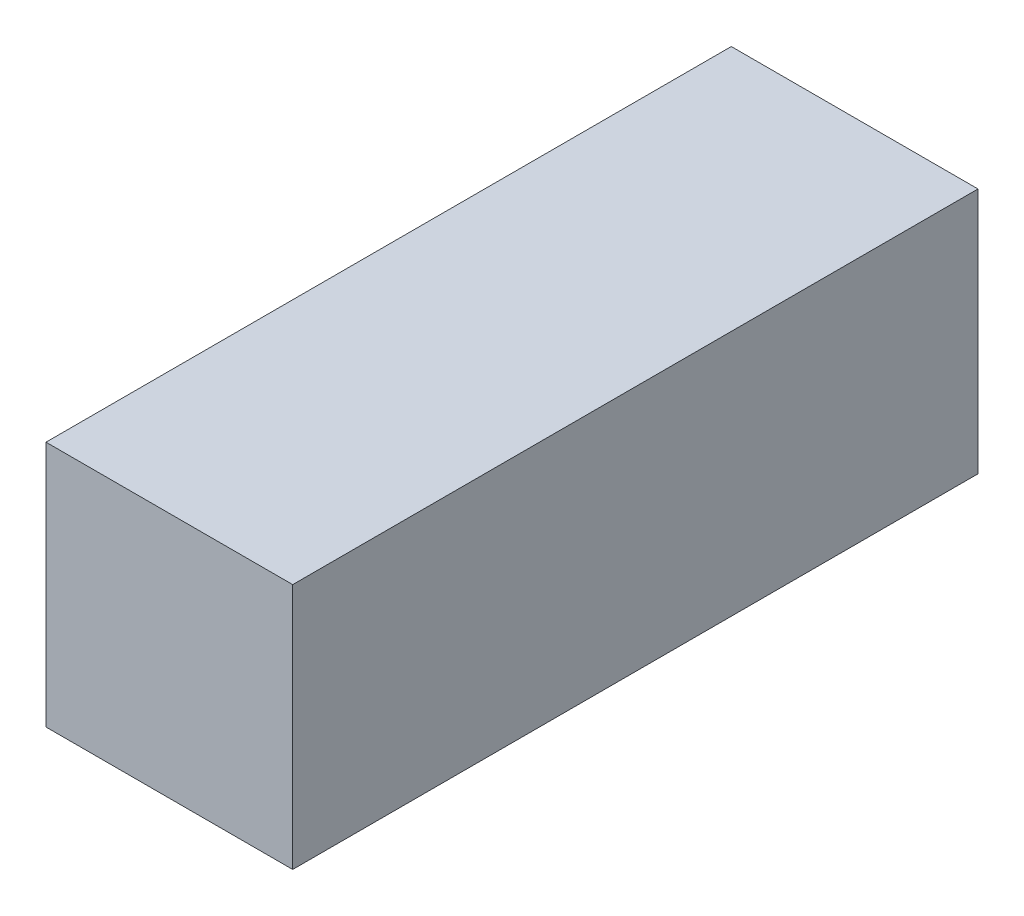
ISO-10303-21;
HEADER;
FILE_DESCRIPTION(('STEP AP214'),'2;1');
FILE_NAME('part.step','',(''),(''),'','','');
FILE_SCHEMA(('AUTOMOTIVE_DESIGN { 1 0 10303 214 1 1 1 1 }'));
ENDSEC;
DATA;
#1=APPLICATION_CONTEXT('core data for automotive mechanical design processes');
#2=APPLICATION_PROTOCOL_DEFINITION('international standard','automotive_design',2000,#1);
#3=PRODUCT_CONTEXT('',#1,'mechanical');
#4=PRODUCT('Part','Part','',(#3));
#5=PRODUCT_RELATED_PRODUCT_CATEGORY('part','',(#4));
#6=PRODUCT_DEFINITION_FORMATION('','',#4);
#7=PRODUCT_DEFINITION_CONTEXT('part definition',#1,'design');
#8=PRODUCT_DEFINITION('design','',#6,#7);
#9=PRODUCT_DEFINITION_SHAPE('','',#8);
#10=(LENGTH_UNIT() NAMED_UNIT(*) SI_UNIT(.MILLI.,.METRE.));
#11=(NAMED_UNIT(*) PLANE_ANGLE_UNIT() SI_UNIT($,.RADIAN.));
#12=(NAMED_UNIT(*) SI_UNIT($,.STERADIAN.) SOLID_ANGLE_UNIT());
#13=UNCERTAINTY_MEASURE_WITH_UNIT(LENGTH_MEASURE(1.E-05),#10,'distance_accuracy_value','');
#14=(GEOMETRIC_REPRESENTATION_CONTEXT(3) GLOBAL_UNCERTAINTY_ASSIGNED_CONTEXT((#13)) GLOBAL_UNIT_ASSIGNED_CONTEXT((#10,
#11,#12)) REPRESENTATION_CONTEXT('',''));
#15=CARTESIAN_POINT('',(0.,0.,0.));
#16=DIRECTION('',(0.,0.,1.));
#17=DIRECTION('',(1.,0.,0.));
#18=AXIS2_PLACEMENT_3D('',#15,#16,#17);
#19=CARTESIAN_POINT('',(18.,-18.,-100.));
#20=DIRECTION('',(1.,0.,0.));
#21=DIRECTION('',(0.,0.,-1.));
#22=AXIS2_PLACEMENT_3D('',#19,#20,#21);
#23=PLANE('',#22);
#24=DIRECTION('',(0.,1.,0.));
#25=VECTOR('',#24,1.);
#26=CARTESIAN_POINT('',(18.,-18.,0.));
#27=LINE('',#26,#25);
#28=CARTESIAN_POINT('',(18.,-18.,0.));
#29=VERTEX_POINT('',#28);
#30=CARTESIAN_POINT('',(18.,18.,0.));
#31=VERTEX_POINT('',#30);
#32=EDGE_CURVE('E111',#29,#31,#27,.T.);
#33=ORIENTED_EDGE('',*,*,#32,.F.);
#34=DIRECTION('',(0.,0.,1.));
#35=VECTOR('',#34,1.);
#36=CARTESIAN_POINT('',(18.,-18.,-100.));
#37=LINE('',#36,#35);
#38=CARTESIAN_POINT('',(18.,-18.,-100.));
#39=VERTEX_POINT('',#38);
#40=EDGE_CURVE('E11',#39,#29,#37,.T.);
#41=ORIENTED_EDGE('',*,*,#40,.F.);
#42=DIRECTION('',(0.,1.,0.));
#43=VECTOR('',#42,1.);
#44=CARTESIAN_POINT('',(18.,-18.,-100.));
#45=LINE('',#44,#43);
#46=CARTESIAN_POINT('',(18.,18.,-100.));
#47=VERTEX_POINT('',#46);
#48=EDGE_CURVE('E102',#39,#47,#45,.T.);
#49=ORIENTED_EDGE('',*,*,#48,.T.);
#50=DIRECTION('',(0.,0.,1.));
#51=VECTOR('',#50,1.);
#52=CARTESIAN_POINT('',(18.,18.,-100.));
#53=LINE('',#52,#51);
#54=EDGE_CURVE('E43',#47,#31,#53,.T.);
#55=ORIENTED_EDGE('',*,*,#54,.T.);
#56=EDGE_LOOP('',(#33,#41,#49,#55));
#57=FACE_BOUND('',#56,.T.);
#58=ADVANCED_FACE('F40',(#57),#23,.T.);
#59=CARTESIAN_POINT('',(-18.,-18.,-100.));
#60=DIRECTION('',(0.,-1.,0.));
#61=DIRECTION('',(0.,0.,-1.));
#62=AXIS2_PLACEMENT_3D('',#59,#60,#61);
#63=PLANE('',#62);
#64=DIRECTION('',(1.,0.,0.));
#65=VECTOR('',#64,1.);
#66=CARTESIAN_POINT('',(-18.,-18.,0.));
#67=LINE('',#66,#65);
#68=CARTESIAN_POINT('',(-18.,-18.,0.));
#69=VERTEX_POINT('',#68);
#70=EDGE_CURVE('E106',#69,#29,#67,.T.);
#71=ORIENTED_EDGE('',*,*,#70,.F.);
#72=DIRECTION('',(0.,0.,1.));
#73=VECTOR('',#72,1.);
#74=CARTESIAN_POINT('',(-18.,-18.,-100.));
#75=LINE('',#74,#73);
#76=CARTESIAN_POINT('',(-18.,-18.,-100.));
#77=VERTEX_POINT('',#76);
#78=EDGE_CURVE('E50',#77,#69,#75,.T.);
#79=ORIENTED_EDGE('',*,*,#78,.F.);
#80=DIRECTION('',(1.,0.,0.));
#81=VECTOR('',#80,1.);
#82=CARTESIAN_POINT('',(-18.,-18.,-100.));
#83=LINE('',#82,#81);
#84=EDGE_CURVE('E97',#77,#39,#83,.T.);
#85=ORIENTED_EDGE('',*,*,#84,.T.);
#86=ORIENTED_EDGE('',*,*,#40,.T.);
#87=EDGE_LOOP('',(#71,#79,#85,#86));
#88=FACE_BOUND('',#87,.T.);
#89=ADVANCED_FACE('F133',(#88),#63,.T.);
#90=CARTESIAN_POINT('',(-18.,-18.,-100.));
#91=DIRECTION('',(-1.,0.,0.));
#92=DIRECTION('',(0.,0.,1.));
#93=AXIS2_PLACEMENT_3D('',#90,#91,#92);
#94=PLANE('',#93);
#95=DIRECTION('',(0.,-1.,0.));
#96=VECTOR('',#95,1.);
#97=CARTESIAN_POINT('',(-18.,-18.,0.));
#98=LINE('',#97,#96);
#99=CARTESIAN_POINT('',(-18.,18.,0.));
#100=VERTEX_POINT('',#99);
#101=EDGE_CURVE('E91',#100,#69,#98,.T.);
#102=ORIENTED_EDGE('',*,*,#101,.F.);
#103=DIRECTION('',(0.,0.,1.));
#104=VECTOR('',#103,1.);
#105=CARTESIAN_POINT('',(-18.,18.,-100.));
#106=LINE('',#105,#104);
#107=CARTESIAN_POINT('',(-18.,18.,-100.));
#108=VERTEX_POINT('',#107);
#109=EDGE_CURVE('E86',#108,#100,#106,.T.);
#110=ORIENTED_EDGE('',*,*,#109,.F.);
#111=DIRECTION('',(0.,-1.,0.));
#112=VECTOR('',#111,1.);
#113=CARTESIAN_POINT('',(-18.,-18.,-100.));
#114=LINE('',#113,#112);
#115=EDGE_CURVE('E89',#108,#77,#114,.T.);
#116=ORIENTED_EDGE('',*,*,#115,.T.);
#117=ORIENTED_EDGE('',*,*,#78,.T.);
#118=EDGE_LOOP('',(#102,#110,#116,#117));
#119=FACE_BOUND('',#118,.T.);
#120=ADVANCED_FACE('F88',(#119),#94,.T.);
#121=CARTESIAN_POINT('',(-18.,18.,-100.));
#122=DIRECTION('',(0.,1.,0.));
#123=DIRECTION('',(0.,0.,1.));
#124=AXIS2_PLACEMENT_3D('',#121,#122,#123);
#125=PLANE('',#124);
#126=DIRECTION('',(-1.,0.,0.));
#127=VECTOR('',#126,1.);
#128=CARTESIAN_POINT('',(-18.,18.,0.));
#129=LINE('',#128,#127);
#130=EDGE_CURVE('E115',#31,#100,#129,.T.);
#131=ORIENTED_EDGE('',*,*,#130,.F.);
#132=ORIENTED_EDGE('',*,*,#54,.F.);
#133=DIRECTION('',(-1.,0.,0.));
#134=VECTOR('',#133,1.);
#135=CARTESIAN_POINT('',(-18.,18.,-100.));
#136=LINE('',#135,#134);
#137=EDGE_CURVE('E96',#47,#108,#136,.T.);
#138=ORIENTED_EDGE('',*,*,#137,.T.);
#139=ORIENTED_EDGE('',*,*,#109,.T.);
#140=EDGE_LOOP('',(#131,#132,#138,#139));
#141=FACE_BOUND('',#140,.T.);
#142=ADVANCED_FACE('F100',(#141),#125,.T.);
#143=CARTESIAN_POINT('',(0.,0.,-100.));
#144=DIRECTION('',(0.,0.,-1.));
#145=DIRECTION('',(-1.,0.,0.));
#146=AXIS2_PLACEMENT_3D('',#143,#144,#145);
#147=PLANE('',#146);
#148=ORIENTED_EDGE('',*,*,#48,.F.);
#149=ORIENTED_EDGE('',*,*,#84,.F.);
#150=ORIENTED_EDGE('',*,*,#115,.F.);
#151=ORIENTED_EDGE('',*,*,#137,.F.);
#152=EDGE_LOOP('',(#148,#149,#150,#151));
#153=FACE_BOUND('',#152,.T.);
#154=ADVANCED_FACE('F95',(#153),#147,.T.);
#155=CARTESIAN_POINT('',(0.,0.,0.));
#156=DIRECTION('',(0.,0.,-1.));
#157=DIRECTION('',(-1.,0.,0.));
#158=AXIS2_PLACEMENT_3D('',#155,#156,#157);
#159=PLANE('',#158);
#160=ORIENTED_EDGE('',*,*,#32,.T.);
#161=ORIENTED_EDGE('',*,*,#130,.T.);
#162=ORIENTED_EDGE('',*,*,#101,.T.);
#163=ORIENTED_EDGE('',*,*,#70,.T.);
#164=EDGE_LOOP('',(#160,#161,#162,#163));
#165=FACE_BOUND('',#164,.T.);
#166=ADVANCED_FACE('F132',(#165),#159,.F.);
#167=CLOSED_SHELL('',(#58,#89,#120,#142,#154,#166));
#168=MANIFOLD_SOLID_BREP('B2',#167);
#169=ADVANCED_BREP_SHAPE_REPRESENTATION('',(#18,#168),#14);
#170=SHAPE_DEFINITION_REPRESENTATION(#9,#169);
ENDSEC;
END-ISO-10303-21;
